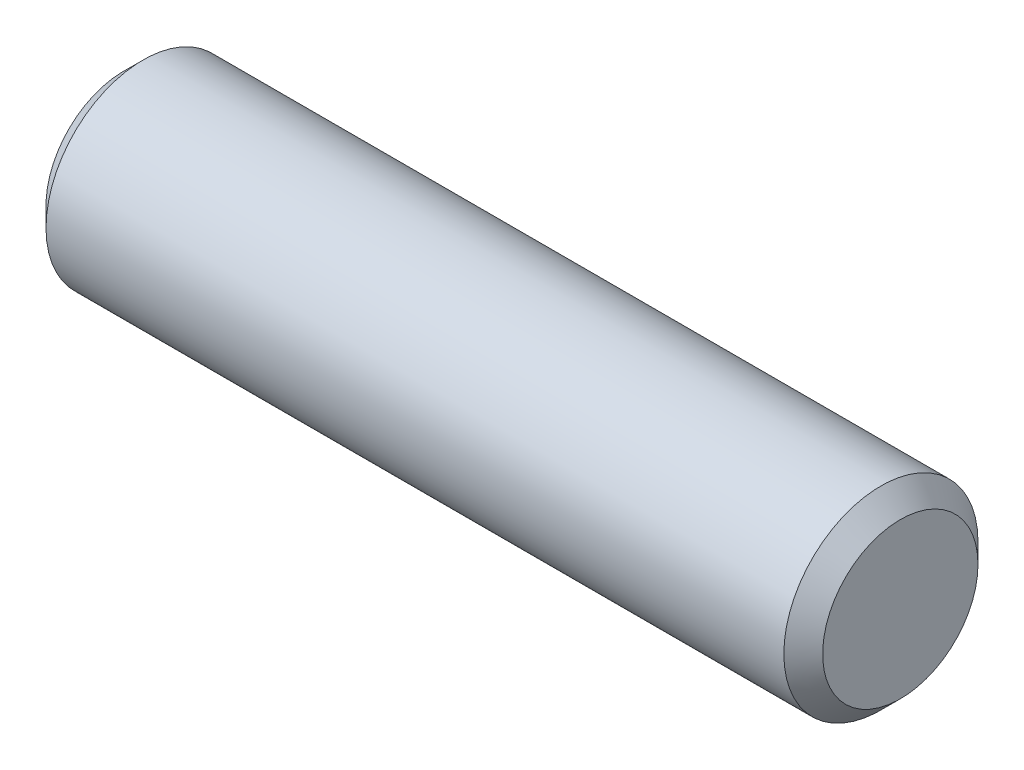
ISO-10303-21;
HEADER;
FILE_DESCRIPTION(('STEP AP214'),'2;1');
FILE_NAME('part.step','',(''),(''),'','','');
FILE_SCHEMA(('AUTOMOTIVE_DESIGN { 1 0 10303 214 1 1 1 1 }'));
ENDSEC;
DATA;
#1=APPLICATION_CONTEXT('core data for automotive mechanical design processes');
#2=APPLICATION_PROTOCOL_DEFINITION('international standard','automotive_design',2000,#1);
#3=PRODUCT_CONTEXT('',#1,'mechanical');
#4=PRODUCT('Part','Part','',(#3));
#5=PRODUCT_RELATED_PRODUCT_CATEGORY('part','',(#4));
#6=PRODUCT_DEFINITION_FORMATION('','',#4);
#7=PRODUCT_DEFINITION_CONTEXT('part definition',#1,'design');
#8=PRODUCT_DEFINITION('design','',#6,#7);
#9=PRODUCT_DEFINITION_SHAPE('','',#8);
#10=(LENGTH_UNIT() NAMED_UNIT(*) SI_UNIT(.MILLI.,.METRE.));
#11=(NAMED_UNIT(*) PLANE_ANGLE_UNIT() SI_UNIT($,.RADIAN.));
#12=(NAMED_UNIT(*) SI_UNIT($,.STERADIAN.) SOLID_ANGLE_UNIT());
#13=UNCERTAINTY_MEASURE_WITH_UNIT(LENGTH_MEASURE(1.E-05),#10,'distance_accuracy_value','');
#14=(GEOMETRIC_REPRESENTATION_CONTEXT(3) GLOBAL_UNCERTAINTY_ASSIGNED_CONTEXT((#13)) GLOBAL_UNIT_ASSIGNED_CONTEXT((#10,
#11,#12)) REPRESENTATION_CONTEXT('',''));
#15=CARTESIAN_POINT('',(0.,0.,0.));
#16=DIRECTION('',(0.,0.,1.));
#17=DIRECTION('',(1.,0.,0.));
#18=AXIS2_PLACEMENT_3D('',#15,#16,#17);
#19=CARTESIAN_POINT('',(-6.35,0.,0.));
#20=DIRECTION('',(1.,0.,0.));
#21=DIRECTION('',(0.,0.,-1.));
#22=AXIS2_PLACEMENT_3D('',#19,#20,#21);
#23=CYLINDRICAL_SURFACE('',#22,1.5875);
#24=CARTESIAN_POINT('',(6.0325,0.,0.));
#25=DIRECTION('',(1.,0.,0.));
#26=DIRECTION('',(0.,0.,-1.));
#27=AXIS2_PLACEMENT_3D('',#24,#25,#26);
#28=CIRCLE('',#27,1.5875);
#29=CARTESIAN_POINT('',(6.0325,0.,-1.5875));
#30=VERTEX_POINT('',#29);
#31=EDGE_CURVE('E49',#30,#30,#28,.F.);
#32=ORIENTED_EDGE('',*,*,#31,.T.);
#33=EDGE_LOOP('',(#32));
#34=FACE_BOUND('',#33,.T.);
#35=CARTESIAN_POINT('',(-6.0325,0.,0.));
#36=DIRECTION('',(1.,0.,0.));
#37=DIRECTION('',(0.,0.,-1.));
#38=AXIS2_PLACEMENT_3D('',#35,#36,#37);
#39=CIRCLE('',#38,1.5875);
#40=CARTESIAN_POINT('',(-6.0325,0.,-1.5875));
#41=VERTEX_POINT('',#40);
#42=EDGE_CURVE('E55',#41,#41,#39,.T.);
#43=ORIENTED_EDGE('',*,*,#42,.T.);
#44=EDGE_LOOP('',(#43));
#45=FACE_BOUND('',#44,.T.);
#46=ADVANCED_FACE('F41',(#34,#45),#23,.T.);
#47=CARTESIAN_POINT('',(-6.35,0.,0.));
#48=DIRECTION('',(1.,0.,0.));
#49=DIRECTION('',(0.,0.,-1.));
#50=AXIS2_PLACEMENT_3D('',#47,#48,#49);
#51=PLANE('',#50);
#52=CARTESIAN_POINT('',(-6.35,0.,0.));
#53=DIRECTION('',(1.,0.,0.));
#54=DIRECTION('',(0.,0.,-1.));
#55=AXIS2_PLACEMENT_3D('',#52,#53,#54);
#56=CIRCLE('',#55,1.27);
#57=CARTESIAN_POINT('',(-6.35,0.,-1.27));
#58=VERTEX_POINT('',#57);
#59=EDGE_CURVE('E10',#58,#58,#56,.F.);
#60=ORIENTED_EDGE('',*,*,#59,.T.);
#61=EDGE_LOOP('',(#60));
#62=FACE_BOUND('',#61,.T.);
#63=ADVANCED_FACE('F75',(#62),#51,.F.);
#64=CARTESIAN_POINT('',(6.35,0.,0.));
#65=DIRECTION('',(1.,0.,0.));
#66=DIRECTION('',(0.,0.,-1.));
#67=AXIS2_PLACEMENT_3D('',#64,#65,#66);
#68=PLANE('',#67);
#69=CARTESIAN_POINT('',(6.35,0.,0.));
#70=DIRECTION('',(1.,0.,0.));
#71=DIRECTION('',(0.,0.,-1.));
#72=AXIS2_PLACEMENT_3D('',#69,#70,#71);
#73=CIRCLE('',#72,1.27);
#74=CARTESIAN_POINT('',(6.35,0.,-1.27));
#75=VERTEX_POINT('',#74);
#76=EDGE_CURVE('E60',#75,#75,#73,.T.);
#77=ORIENTED_EDGE('',*,*,#76,.T.);
#78=EDGE_LOOP('',(#77));
#79=FACE_BOUND('',#78,.T.);
#80=ADVANCED_FACE('F66',(#79),#68,.T.);
#81=CARTESIAN_POINT('',(6.35,0.,0.));
#82=DIRECTION('',(-1.,0.,0.));
#83=DIRECTION('',(0.,0.,1.));
#84=AXIS2_PLACEMENT_3D('',#81,#82,#83);
#85=CONICAL_SURFACE('',#84,1.27,0.785398163397448);
#86=ORIENTED_EDGE('',*,*,#31,.F.);
#87=EDGE_LOOP('',(#86));
#88=FACE_BOUND('',#87,.T.);
#89=ORIENTED_EDGE('',*,*,#76,.F.);
#90=EDGE_LOOP('',(#89));
#91=FACE_BOUND('',#90,.T.);
#92=ADVANCED_FACE('F68',(#88,#91),#85,.T.);
#93=CARTESIAN_POINT('',(-6.0325,0.,0.));
#94=DIRECTION('',(1.,0.,0.));
#95=DIRECTION('',(0.,0.,-1.));
#96=AXIS2_PLACEMENT_3D('',#93,#94,#95);
#97=CONICAL_SURFACE('',#96,1.5875,0.78539816339745);
#98=ORIENTED_EDGE('',*,*,#59,.F.);
#99=EDGE_LOOP('',(#98));
#100=FACE_BOUND('',#99,.T.);
#101=ORIENTED_EDGE('',*,*,#42,.F.);
#102=EDGE_LOOP('',(#101));
#103=FACE_BOUND('',#102,.T.);
#104=ADVANCED_FACE('F43',(#100,#103),#97,.T.);
#105=CLOSED_SHELL('',(#46,#63,#80,#92,#104));
#106=MANIFOLD_SOLID_BREP('B2',#105);
#107=ADVANCED_BREP_SHAPE_REPRESENTATION('',(#18,#106),#14);
#108=SHAPE_DEFINITION_REPRESENTATION(#9,#107);
ENDSEC;
END-ISO-10303-21;
